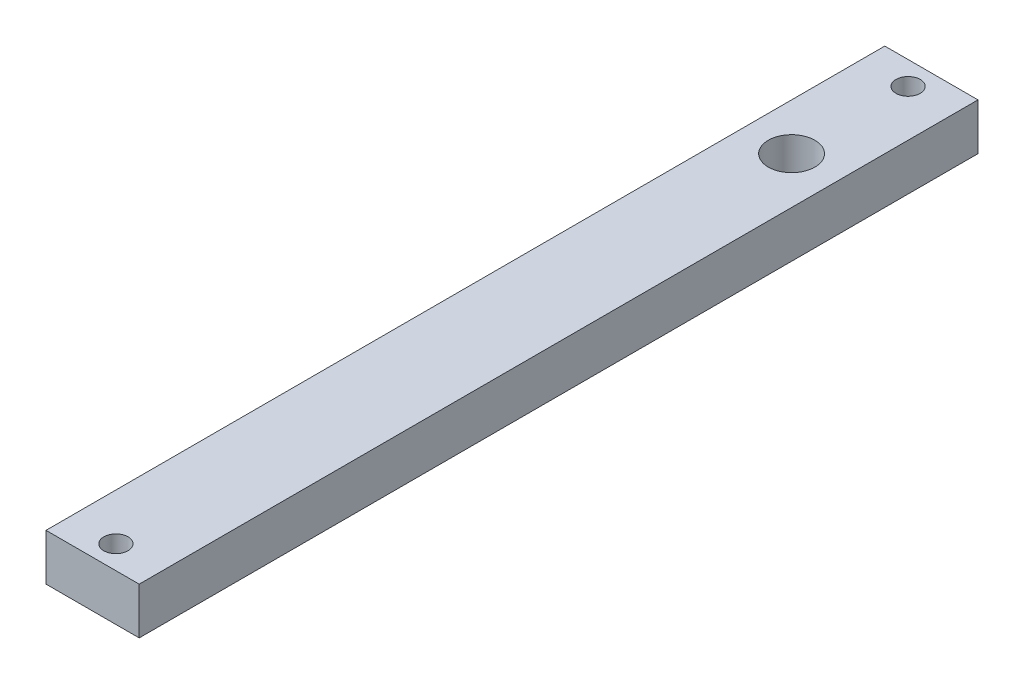
ISO-10303-21;
HEADER;
FILE_DESCRIPTION(('STEP AP214'),'2;1');
FILE_NAME('part.step','',(''),(''),'','','');
FILE_SCHEMA(('AUTOMOTIVE_DESIGN { 1 0 10303 214 1 1 1 1 }'));
ENDSEC;
DATA;
#1=APPLICATION_CONTEXT('core data for automotive mechanical design processes');
#2=APPLICATION_PROTOCOL_DEFINITION('international standard','automotive_design',2000,#1);
#3=PRODUCT_CONTEXT('',#1,'mechanical');
#4=PRODUCT('Part','Part','',(#3));
#5=PRODUCT_RELATED_PRODUCT_CATEGORY('part','',(#4));
#6=PRODUCT_DEFINITION_FORMATION('','',#4);
#7=PRODUCT_DEFINITION_CONTEXT('part definition',#1,'design');
#8=PRODUCT_DEFINITION('design','',#6,#7);
#9=PRODUCT_DEFINITION_SHAPE('','',#8);
#10=(LENGTH_UNIT() NAMED_UNIT(*) SI_UNIT(.MILLI.,.METRE.));
#11=(NAMED_UNIT(*) PLANE_ANGLE_UNIT() SI_UNIT($,.RADIAN.));
#12=(NAMED_UNIT(*) SI_UNIT($,.STERADIAN.) SOLID_ANGLE_UNIT());
#13=UNCERTAINTY_MEASURE_WITH_UNIT(LENGTH_MEASURE(1.E-05),#10,'distance_accuracy_value','');
#14=(GEOMETRIC_REPRESENTATION_CONTEXT(3) GLOBAL_UNCERTAINTY_ASSIGNED_CONTEXT((#13)) GLOBAL_UNIT_ASSIGNED_CONTEXT((#10,
#11,#12)) REPRESENTATION_CONTEXT('',''));
#15=CARTESIAN_POINT('',(0.,0.,0.));
#16=DIRECTION('',(0.,0.,1.));
#17=DIRECTION('',(1.,0.,0.));
#18=AXIS2_PLACEMENT_3D('',#15,#16,#17);
#19=CARTESIAN_POINT('',(-6.35,6.35,-50.8));
#20=DIRECTION('',(1.,0.,0.));
#21=DIRECTION('',(0.,0.,-1.));
#22=AXIS2_PLACEMENT_3D('',#19,#20,#21);
#23=PLANE('',#22);
#24=DIRECTION('',(0.,0.,1.));
#25=VECTOR('',#24,1.);
#26=CARTESIAN_POINT('',(-6.35,0.,-50.8));
#27=LINE('',#26,#25);
#28=CARTESIAN_POINT('',(-6.35000000000004,0.,-57.15));
#29=VERTEX_POINT('',#28);
#30=CARTESIAN_POINT('',(-6.35000000000004,0.,57.1499999999999));
#31=VERTEX_POINT('',#30);
#32=EDGE_CURVE('E58',#29,#31,#27,.T.);
#33=ORIENTED_EDGE('',*,*,#32,.T.);
#34=DIRECTION('',(0.,1.,0.));
#35=VECTOR('',#34,1.);
#36=CARTESIAN_POINT('',(-6.35000000000004,-14.1990316571237,57.1499999999999));
#37=LINE('',#36,#35);
#38=CARTESIAN_POINT('',(-6.35000000000004,6.35,57.1499999999999));
#39=VERTEX_POINT('',#38);
#40=EDGE_CURVE('E92',#31,#39,#37,.T.);
#41=ORIENTED_EDGE('',*,*,#40,.T.);
#42=DIRECTION('',(0.,0.,1.));
#43=VECTOR('',#42,1.);
#44=CARTESIAN_POINT('',(-6.35,6.35,-50.8));
#45=LINE('',#44,#43);
#46=CARTESIAN_POINT('',(-6.35000000000004,6.35,-57.15));
#47=VERTEX_POINT('',#46);
#48=EDGE_CURVE('E44',#47,#39,#45,.T.);
#49=ORIENTED_EDGE('',*,*,#48,.F.);
#50=DIRECTION('',(0.,1.,0.));
#51=VECTOR('',#50,1.);
#52=CARTESIAN_POINT('',(-6.35000000000004,-14.1990316571237,-57.15));
#53=LINE('',#52,#51);
#54=EDGE_CURVE('E111',#29,#47,#53,.T.);
#55=ORIENTED_EDGE('',*,*,#54,.F.);
#56=EDGE_LOOP('',(#33,#41,#49,#55));
#57=FACE_BOUND('',#56,.T.);
#58=ADVANCED_FACE('F36',(#57),#23,.F.);
#59=CARTESIAN_POINT('',(6.35,6.35,-50.8));
#60=DIRECTION('',(-1.,0.,0.));
#61=DIRECTION('',(0.,0.,1.));
#62=AXIS2_PLACEMENT_3D('',#59,#60,#61);
#63=PLANE('',#62);
#64=DIRECTION('',(0.,0.,-1.));
#65=VECTOR('',#64,1.);
#66=CARTESIAN_POINT('',(6.35,0.,-50.8));
#67=LINE('',#66,#65);
#68=CARTESIAN_POINT('',(6.35000000000004,0.,57.1499999999999));
#69=VERTEX_POINT('',#68);
#70=CARTESIAN_POINT('',(6.34999999999996,0.,-57.15));
#71=VERTEX_POINT('',#70);
#72=EDGE_CURVE('E39',#69,#71,#67,.T.);
#73=ORIENTED_EDGE('',*,*,#72,.T.);
#74=DIRECTION('',(0.,1.,0.));
#75=VECTOR('',#74,1.);
#76=CARTESIAN_POINT('',(6.34999999999996,-14.1990316571237,-57.15));
#77=LINE('',#76,#75);
#78=CARTESIAN_POINT('',(6.34999999999996,6.35,-57.15));
#79=VERTEX_POINT('',#78);
#80=EDGE_CURVE('E107',#71,#79,#77,.T.);
#81=ORIENTED_EDGE('',*,*,#80,.T.);
#82=DIRECTION('',(0.,0.,-1.));
#83=VECTOR('',#82,1.);
#84=CARTESIAN_POINT('',(6.35,6.35,-50.8));
#85=LINE('',#84,#83);
#86=CARTESIAN_POINT('',(6.35000000000004,6.35,57.1499999999999));
#87=VERTEX_POINT('',#86);
#88=EDGE_CURVE('E11',#87,#79,#85,.T.);
#89=ORIENTED_EDGE('',*,*,#88,.F.);
#90=DIRECTION('',(0.,1.,0.));
#91=VECTOR('',#90,1.);
#92=CARTESIAN_POINT('',(6.35000000000004,-14.1990316571237,57.1499999999999));
#93=LINE('',#92,#91);
#94=EDGE_CURVE('E83',#69,#87,#93,.T.);
#95=ORIENTED_EDGE('',*,*,#94,.F.);
#96=EDGE_LOOP('',(#73,#81,#89,#95));
#97=FACE_BOUND('',#96,.T.);
#98=ADVANCED_FACE('F84',(#97),#63,.F.);
#99=CARTESIAN_POINT('',(0.,6.35,0.));
#100=DIRECTION('',(0.,-1.,0.));
#101=DIRECTION('',(0.,0.,-1.));
#102=AXIS2_PLACEMENT_3D('',#99,#100,#101);
#103=PLANE('',#102);
#104=CARTESIAN_POINT('',(0.,6.35,-38.1));
#105=DIRECTION('',(0.,1.,0.));
#106=DIRECTION('',(0.,0.,1.));
#107=AXIS2_PLACEMENT_3D('',#104,#105,#106);
#108=CIRCLE('',#107,3.17499999999999);
#109=CARTESIAN_POINT('',(0.,6.35,-34.925));
#110=VERTEX_POINT('',#109);
#111=EDGE_CURVE('E127',#110,#110,#108,.T.);
#112=ORIENTED_EDGE('',*,*,#111,.F.);
#113=EDGE_LOOP('',(#112));
#114=FACE_BOUND('',#113,.T.);
#115=ORIENTED_EDGE('',*,*,#48,.T.);
#116=DIRECTION('',(1.,0.,0.));
#117=VECTOR('',#116,1.);
#118=CARTESIAN_POINT('',(-6.35000000000004,6.35,57.1499999999999));
#119=LINE('',#118,#117);
#120=EDGE_CURVE('E122',#39,#87,#119,.T.);
#121=ORIENTED_EDGE('',*,*,#120,.T.);
#122=ORIENTED_EDGE('',*,*,#88,.T.);
#123=DIRECTION('',(-1.,0.,0.));
#124=VECTOR('',#123,1.);
#125=CARTESIAN_POINT('',(-6.35000000000004,6.35,-57.15));
#126=LINE('',#125,#124);
#127=EDGE_CURVE('E100',#79,#47,#126,.T.);
#128=ORIENTED_EDGE('',*,*,#127,.T.);
#129=EDGE_LOOP('',(#115,#121,#122,#128));
#130=FACE_BOUND('',#129,.T.);
#131=CARTESIAN_POINT('',(0.,6.35,-53.975));
#132=DIRECTION('',(0.,1.,0.));
#133=DIRECTION('',(0.,0.,1.));
#134=AXIS2_PLACEMENT_3D('',#131,#132,#133);
#135=CIRCLE('',#134,1.65099999999999);
#136=CARTESIAN_POINT('',(0.,6.35,-52.324));
#137=VERTEX_POINT('',#136);
#138=EDGE_CURVE('E104',#137,#137,#135,.T.);
#139=ORIENTED_EDGE('',*,*,#138,.F.);
#140=EDGE_LOOP('',(#139));
#141=FACE_BOUND('',#140,.T.);
#142=CARTESIAN_POINT('',(0.,6.35,53.975));
#143=DIRECTION('',(0.,1.,0.));
#144=DIRECTION('',(0.,0.,1.));
#145=AXIS2_PLACEMENT_3D('',#142,#143,#144);
#146=CIRCLE('',#145,1.651);
#147=CARTESIAN_POINT('',(0.,6.35,55.626));
#148=VERTEX_POINT('',#147);
#149=EDGE_CURVE('E88',#148,#148,#146,.T.);
#150=ORIENTED_EDGE('',*,*,#149,.F.);
#151=EDGE_LOOP('',(#150));
#152=FACE_BOUND('',#151,.T.);
#153=ADVANCED_FACE('F120',(#114,#130,#141,#152),#103,.F.);
#154=CARTESIAN_POINT('',(0.,0.,0.));
#155=DIRECTION('',(0.,-1.,0.));
#156=DIRECTION('',(0.,0.,-1.));
#157=AXIS2_PLACEMENT_3D('',#154,#155,#156);
#158=PLANE('',#157);
#159=CARTESIAN_POINT('',(0.,0.,-38.1));
#160=DIRECTION('',(0.,1.,0.));
#161=DIRECTION('',(0.,0.,1.));
#162=AXIS2_PLACEMENT_3D('',#159,#160,#161);
#163=CIRCLE('',#162,3.17499999999999);
#164=CARTESIAN_POINT('',(0.,0.,-34.925));
#165=VERTEX_POINT('',#164);
#166=EDGE_CURVE('E94',#165,#165,#163,.T.);
#167=ORIENTED_EDGE('',*,*,#166,.T.);
#168=EDGE_LOOP('',(#167));
#169=FACE_BOUND('',#168,.T.);
#170=ORIENTED_EDGE('',*,*,#32,.F.);
#171=DIRECTION('',(-1.,0.,0.));
#172=VECTOR('',#171,1.);
#173=CARTESIAN_POINT('',(-6.35000000000004,0.,-57.15));
#174=LINE('',#173,#172);
#175=EDGE_CURVE('E80',#71,#29,#174,.T.);
#176=ORIENTED_EDGE('',*,*,#175,.F.);
#177=ORIENTED_EDGE('',*,*,#72,.F.);
#178=DIRECTION('',(1.,0.,0.));
#179=VECTOR('',#178,1.);
#180=CARTESIAN_POINT('',(-6.35000000000004,0.,57.1499999999999));
#181=LINE('',#180,#179);
#182=EDGE_CURVE('E77',#31,#69,#181,.T.);
#183=ORIENTED_EDGE('',*,*,#182,.F.);
#184=EDGE_LOOP('',(#170,#176,#177,#183));
#185=FACE_BOUND('',#184,.T.);
#186=CARTESIAN_POINT('',(0.,0.,-53.975));
#187=DIRECTION('',(0.,-1.,0.));
#188=DIRECTION('',(0.,0.,-1.));
#189=AXIS2_PLACEMENT_3D('',#186,#187,#188);
#190=CIRCLE('',#189,1.65099999999999);
#191=CARTESIAN_POINT('',(0.,0.,-55.626));
#192=VERTEX_POINT('',#191);
#193=EDGE_CURVE('E103',#192,#192,#190,.F.);
#194=ORIENTED_EDGE('',*,*,#193,.T.);
#195=EDGE_LOOP('',(#194));
#196=FACE_BOUND('',#195,.T.);
#197=CARTESIAN_POINT('',(0.,0.,53.975));
#198=DIRECTION('',(0.,-1.,0.));
#199=DIRECTION('',(0.,0.,-1.));
#200=AXIS2_PLACEMENT_3D('',#197,#198,#199);
#201=CIRCLE('',#200,1.651);
#202=CARTESIAN_POINT('',(0.,0.,52.324));
#203=VERTEX_POINT('',#202);
#204=EDGE_CURVE('E97',#203,#203,#201,.F.);
#205=ORIENTED_EDGE('',*,*,#204,.T.);
#206=EDGE_LOOP('',(#205));
#207=FACE_BOUND('',#206,.T.);
#208=ADVANCED_FACE('F74',(#169,#185,#196,#207),#158,.T.);
#209=CARTESIAN_POINT('',(-6.35000000000004,-14.1990316571237,-57.15));
#210=DIRECTION('',(0.,0.,-1.));
#211=DIRECTION('',(-1.,0.,0.));
#212=AXIS2_PLACEMENT_3D('',#209,#210,#211);
#213=PLANE('',#212);
#214=ORIENTED_EDGE('',*,*,#80,.F.);
#215=ORIENTED_EDGE('',*,*,#175,.T.);
#216=ORIENTED_EDGE('',*,*,#54,.T.);
#217=ORIENTED_EDGE('',*,*,#127,.F.);
#218=EDGE_LOOP('',(#214,#215,#216,#217));
#219=FACE_BOUND('',#218,.T.);
#220=ADVANCED_FACE('F118',(#219),#213,.T.);
#221=CARTESIAN_POINT('',(0.,-14.1990316571237,-53.975));
#222=DIRECTION('',(0.,1.,0.));
#223=DIRECTION('',(0.,0.,1.));
#224=AXIS2_PLACEMENT_3D('',#221,#222,#223);
#225=CYLINDRICAL_SURFACE('',#224,1.65099999999999);
#226=ORIENTED_EDGE('',*,*,#138,.T.);
#227=EDGE_LOOP('',(#226));
#228=FACE_BOUND('',#227,.T.);
#229=ORIENTED_EDGE('',*,*,#193,.F.);
#230=EDGE_LOOP('',(#229));
#231=FACE_BOUND('',#230,.T.);
#232=ADVANCED_FACE('F168',(#228,#231),#225,.F.);
#233=CARTESIAN_POINT('',(-6.35000000000004,-14.1990316571237,57.1499999999999));
#234=DIRECTION('',(0.,0.,1.));
#235=DIRECTION('',(1.,0.,0.));
#236=AXIS2_PLACEMENT_3D('',#233,#234,#235);
#237=PLANE('',#236);
#238=ORIENTED_EDGE('',*,*,#40,.F.);
#239=ORIENTED_EDGE('',*,*,#182,.T.);
#240=ORIENTED_EDGE('',*,*,#94,.T.);
#241=ORIENTED_EDGE('',*,*,#120,.F.);
#242=EDGE_LOOP('',(#238,#239,#240,#241));
#243=FACE_BOUND('',#242,.T.);
#244=ADVANCED_FACE('F90',(#243),#237,.T.);
#245=CARTESIAN_POINT('',(0.,-14.1990316571237,53.975));
#246=DIRECTION('',(0.,1.,0.));
#247=DIRECTION('',(0.,0.,1.));
#248=AXIS2_PLACEMENT_3D('',#245,#246,#247);
#249=CYLINDRICAL_SURFACE('',#248,1.651);
#250=ORIENTED_EDGE('',*,*,#149,.T.);
#251=EDGE_LOOP('',(#250));
#252=FACE_BOUND('',#251,.T.);
#253=ORIENTED_EDGE('',*,*,#204,.F.);
#254=EDGE_LOOP('',(#253));
#255=FACE_BOUND('',#254,.T.);
#256=ADVANCED_FACE('F138',(#252,#255),#249,.F.);
#257=CARTESIAN_POINT('',(0.,0.,-38.1));
#258=DIRECTION('',(0.,1.,0.));
#259=DIRECTION('',(0.,0.,1.));
#260=AXIS2_PLACEMENT_3D('',#257,#258,#259);
#261=CYLINDRICAL_SURFACE('',#260,3.17499999999999);
#262=ORIENTED_EDGE('',*,*,#166,.F.);
#263=EDGE_LOOP('',(#262));
#264=FACE_BOUND('',#263,.T.);
#265=ORIENTED_EDGE('',*,*,#111,.T.);
#266=EDGE_LOOP('',(#265));
#267=FACE_BOUND('',#266,.T.);
#268=ADVANCED_FACE('F135',(#264,#267),#261,.F.);
#269=CLOSED_SHELL('',(#58,#98,#153,#208,#220,#232,#244,#256,#268));
#270=MANIFOLD_SOLID_BREP('B2',#269);
#271=ADVANCED_BREP_SHAPE_REPRESENTATION('',(#18,#270),#14);
#272=SHAPE_DEFINITION_REPRESENTATION(#9,#271);
ENDSEC;
END-ISO-10303-21;
